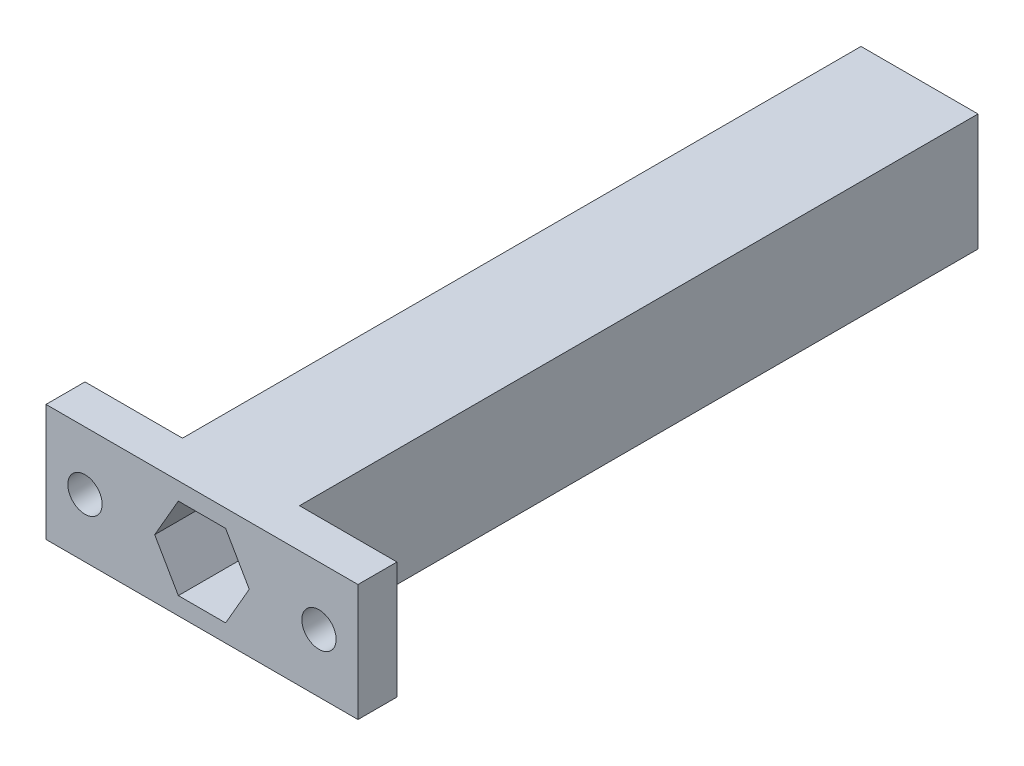
ISO-10303-21;
HEADER;
FILE_DESCRIPTION(('STEP AP214'),'2;1');
FILE_NAME('part.step','',(''),(''),'','','');
FILE_SCHEMA(('AUTOMOTIVE_DESIGN { 1 0 10303 214 1 1 1 1 }'));
ENDSEC;
DATA;
#1=APPLICATION_CONTEXT('core data for automotive mechanical design processes');
#2=APPLICATION_PROTOCOL_DEFINITION('international standard','automotive_design',2000,#1);
#3=PRODUCT_CONTEXT('',#1,'mechanical');
#4=PRODUCT('Part','Part','',(#3));
#5=PRODUCT_RELATED_PRODUCT_CATEGORY('part','',(#4));
#6=PRODUCT_DEFINITION_FORMATION('','',#4);
#7=PRODUCT_DEFINITION_CONTEXT('part definition',#1,'design');
#8=PRODUCT_DEFINITION('design','',#6,#7);
#9=PRODUCT_DEFINITION_SHAPE('','',#8);
#10=(LENGTH_UNIT() NAMED_UNIT(*) SI_UNIT(.MILLI.,.METRE.));
#11=(NAMED_UNIT(*) PLANE_ANGLE_UNIT() SI_UNIT($,.RADIAN.));
#12=(NAMED_UNIT(*) SI_UNIT($,.STERADIAN.) SOLID_ANGLE_UNIT());
#13=UNCERTAINTY_MEASURE_WITH_UNIT(LENGTH_MEASURE(1.E-05),#10,'distance_accuracy_value','');
#14=(GEOMETRIC_REPRESENTATION_CONTEXT(3) GLOBAL_UNCERTAINTY_ASSIGNED_CONTEXT((#13)) GLOBAL_UNIT_ASSIGNED_CONTEXT((#10,
#11,#12)) REPRESENTATION_CONTEXT('',''));
#15=CARTESIAN_POINT('',(0.,0.,0.));
#16=DIRECTION('',(0.,0.,1.));
#17=DIRECTION('',(1.,0.,0.));
#18=AXIS2_PLACEMENT_3D('',#15,#16,#17);
#19=CARTESIAN_POINT('',(43.4999999999998,25.9999999999997,92.));
#20=DIRECTION('',(0.,0.,-1.));
#21=DIRECTION('',(-1.,0.,0.));
#22=AXIS2_PLACEMENT_3D('',#19,#20,#21);
#23=CYLINDRICAL_SURFACE('',#22,3.2);
#24=CARTESIAN_POINT('',(43.4999999999998,25.9999999999997,0.));
#25=DIRECTION('',(0.,0.,1.));
#26=DIRECTION('',(1.,0.,0.));
#27=AXIS2_PLACEMENT_3D('',#24,#25,#26);
#28=CIRCLE('',#27,3.2);
#29=CARTESIAN_POINT('',(46.6999999999998,25.9999999999997,0.));
#30=VERTEX_POINT('',#29);
#31=EDGE_CURVE('E238',#30,#30,#28,.T.);
#32=ORIENTED_EDGE('',*,*,#31,.F.);
#33=EDGE_LOOP('',(#32));
#34=FACE_BOUND('',#33,.T.);
#35=CARTESIAN_POINT('',(43.4999999999998,25.9999999999997,17.));
#36=DIRECTION('',(0.,0.,1.));
#37=DIRECTION('',(1.,0.,0.));
#38=AXIS2_PLACEMENT_3D('',#35,#36,#37);
#39=CIRCLE('',#38,3.2);
#40=CARTESIAN_POINT('',(46.6999999999998,25.9999999999997,17.));
#41=VERTEX_POINT('',#40);
#42=EDGE_CURVE('E37',#41,#41,#39,.T.);
#43=ORIENTED_EDGE('',*,*,#42,.T.);
#44=EDGE_LOOP('',(#43));
#45=FACE_BOUND('',#44,.T.);
#46=ADVANCED_FACE('F33',(#34,#45),#23,.F.);
#47=CARTESIAN_POINT('',(35.9999999999998,33.4999999999997,92.));
#48=DIRECTION('',(1.,0.,0.));
#49=DIRECTION('',(0.,1.,0.));
#50=AXIS2_PLACEMENT_3D('',#47,#48,#49);
#51=PLANE('',#50);
#52=DIRECTION('',(0.,-1.,0.));
#53=VECTOR('',#52,1.);
#54=CARTESIAN_POINT('',(35.9999999999998,33.4999999999997,87.));
#55=LINE('',#54,#53);
#56=CARTESIAN_POINT('',(35.9999999999998,33.4999999999997,87.));
#57=VERTEX_POINT('',#56);
#58=CARTESIAN_POINT('',(35.9999999999998,18.4999999999997,87.));
#59=VERTEX_POINT('',#58);
#60=EDGE_CURVE('E236',#57,#59,#55,.T.);
#61=ORIENTED_EDGE('',*,*,#60,.F.);
#62=DIRECTION('',(0.,0.,-1.));
#63=VECTOR('',#62,1.);
#64=CARTESIAN_POINT('',(35.9999999999998,33.4999999999997,92.));
#65=LINE('',#64,#63);
#66=CARTESIAN_POINT('',(35.9999999999998,33.4999999999997,0.));
#67=VERTEX_POINT('',#66);
#68=EDGE_CURVE('E57',#57,#67,#65,.T.);
#69=ORIENTED_EDGE('',*,*,#68,.T.);
#70=DIRECTION('',(0.,-1.,0.));
#71=VECTOR('',#70,1.);
#72=CARTESIAN_POINT('',(35.9999999999998,33.4999999999997,0.));
#73=LINE('',#72,#71);
#74=CARTESIAN_POINT('',(35.9999999999998,18.4999999999997,0.));
#75=VERTEX_POINT('',#74);
#76=EDGE_CURVE('E241',#67,#75,#73,.T.);
#77=ORIENTED_EDGE('',*,*,#76,.T.);
#78=DIRECTION('',(0.,0.,-1.));
#79=VECTOR('',#78,1.);
#80=CARTESIAN_POINT('',(35.9999999999998,18.4999999999997,92.));
#81=LINE('',#80,#79);
#82=EDGE_CURVE('E11',#59,#75,#81,.T.);
#83=ORIENTED_EDGE('',*,*,#82,.F.);
#84=EDGE_LOOP('',(#61,#69,#77,#83));
#85=FACE_BOUND('',#84,.T.);
#86=ADVANCED_FACE('F35',(#85),#51,.F.);
#87=CARTESIAN_POINT('',(50.9999999999998,33.4999999999997,92.));
#88=DIRECTION('',(-1.,0.,0.));
#89=DIRECTION('',(0.,-1.,0.));
#90=AXIS2_PLACEMENT_3D('',#87,#88,#89);
#91=PLANE('',#90);
#92=DIRECTION('',(0.,1.,0.));
#93=VECTOR('',#92,1.);
#94=CARTESIAN_POINT('',(50.9999999999998,33.4999999999997,87.));
#95=LINE('',#94,#93);
#96=CARTESIAN_POINT('',(50.9999999999998,18.4999999999997,87.));
#97=VERTEX_POINT('',#96);
#98=CARTESIAN_POINT('',(50.9999999999998,33.4999999999997,87.));
#99=VERTEX_POINT('',#98);
#100=EDGE_CURVE('E226',#97,#99,#95,.T.);
#101=ORIENTED_EDGE('',*,*,#100,.F.);
#102=DIRECTION('',(0.,0.,-1.));
#103=VECTOR('',#102,1.);
#104=CARTESIAN_POINT('',(50.9999999999998,18.4999999999997,92.));
#105=LINE('',#104,#103);
#106=CARTESIAN_POINT('',(50.9999999999998,18.4999999999997,0.));
#107=VERTEX_POINT('',#106);
#108=EDGE_CURVE('E42',#97,#107,#105,.T.);
#109=ORIENTED_EDGE('',*,*,#108,.T.);
#110=DIRECTION('',(0.,1.,0.));
#111=VECTOR('',#110,1.);
#112=CARTESIAN_POINT('',(50.9999999999998,33.4999999999997,0.));
#113=LINE('',#112,#111);
#114=CARTESIAN_POINT('',(50.9999999999998,33.4999999999997,0.));
#115=VERTEX_POINT('',#114);
#116=EDGE_CURVE('E251',#107,#115,#113,.T.);
#117=ORIENTED_EDGE('',*,*,#116,.T.);
#118=DIRECTION('',(0.,0.,-1.));
#119=VECTOR('',#118,1.);
#120=CARTESIAN_POINT('',(50.9999999999998,33.4999999999997,92.));
#121=LINE('',#120,#119);
#122=EDGE_CURVE('E256',#99,#115,#121,.T.);
#123=ORIENTED_EDGE('',*,*,#122,.F.);
#124=EDGE_LOOP('',(#101,#109,#117,#123));
#125=FACE_BOUND('',#124,.T.);
#126=ADVANCED_FACE('F261',(#125),#91,.F.);
#127=CARTESIAN_POINT('',(0.,0.,92.));
#128=DIRECTION('',(0.,0.,-1.));
#129=DIRECTION('',(-1.,0.,0.));
#130=AXIS2_PLACEMENT_3D('',#127,#128,#129);
#131=PLANE('',#130);
#132=DIRECTION('',(1.,0.,0.));
#133=VECTOR('',#132,1.);
#134=CARTESIAN_POINT('',(40.4689110867545,20.75,92.));
#135=LINE('',#134,#133);
#136=CARTESIAN_POINT('',(40.4689110867545,20.75,92.));
#137=VERTEX_POINT('',#136);
#138=CARTESIAN_POINT('',(46.5310889132455,20.75,92.));
#139=VERTEX_POINT('',#138);
#140=EDGE_CURVE('E171',#137,#139,#135,.T.);
#141=ORIENTED_EDGE('',*,*,#140,.F.);
#142=DIRECTION('',(0.5,-0.866025403784439,0.));
#143=VECTOR('',#142,1.);
#144=CARTESIAN_POINT('',(37.4378221735089,26.,92.));
#145=LINE('',#144,#143);
#146=CARTESIAN_POINT('',(37.4378221735089,26.,92.));
#147=VERTEX_POINT('',#146);
#148=EDGE_CURVE('E49',#147,#137,#145,.T.);
#149=ORIENTED_EDGE('',*,*,#148,.F.);
#150=DIRECTION('',(-0.500000000000001,-0.866025403784438,0.));
#151=VECTOR('',#150,1.);
#152=CARTESIAN_POINT('',(40.4689110867545,31.25,92.));
#153=LINE('',#152,#151);
#154=CARTESIAN_POINT('',(40.4689110867545,31.25,92.));
#155=VERTEX_POINT('',#154);
#156=EDGE_CURVE('E157',#155,#147,#153,.T.);
#157=ORIENTED_EDGE('',*,*,#156,.F.);
#158=DIRECTION('',(-1.,0.,0.));
#159=VECTOR('',#158,1.);
#160=CARTESIAN_POINT('',(46.5310889132455,31.25,92.));
#161=LINE('',#160,#159);
#162=CARTESIAN_POINT('',(46.5310889132455,31.25,92.));
#163=VERTEX_POINT('',#162);
#164=EDGE_CURVE('E160',#163,#155,#161,.T.);
#165=ORIENTED_EDGE('',*,*,#164,.F.);
#166=DIRECTION('',(-0.499999999999999,0.866025403784439,0.));
#167=VECTOR('',#166,1.);
#168=CARTESIAN_POINT('',(49.5621778264911,26.,92.));
#169=LINE('',#168,#167);
#170=CARTESIAN_POINT('',(49.5621778264911,26.,92.));
#171=VERTEX_POINT('',#170);
#172=EDGE_CURVE('E176',#171,#163,#169,.T.);
#173=ORIENTED_EDGE('',*,*,#172,.F.);
#174=DIRECTION('',(0.5,0.866025403784439,0.));
#175=VECTOR('',#174,1.);
#176=CARTESIAN_POINT('',(46.5310889132455,20.75,92.));
#177=LINE('',#176,#175);
#178=EDGE_CURVE('E173',#139,#171,#177,.T.);
#179=ORIENTED_EDGE('',*,*,#178,.F.);
#180=EDGE_LOOP('',(#141,#149,#157,#165,#173,#179));
#181=FACE_BOUND('',#180,.T.);
#182=DIRECTION('',(-1.,0.,0.));
#183=VECTOR('',#182,1.);
#184=CARTESIAN_POINT('',(50.9999999999998,33.4999999999997,92.));
#185=LINE('',#184,#183);
#186=CARTESIAN_POINT('',(63.4999999999998,33.4999999999997,92.));
#187=VERTEX_POINT('',#186);
#188=CARTESIAN_POINT('',(23.4999999999998,33.4999999999997,92.));
#189=VERTEX_POINT('',#188);
#190=EDGE_CURVE('E244',#187,#189,#185,.T.);
#191=ORIENTED_EDGE('',*,*,#190,.T.);
#192=DIRECTION('',(0.,-1.,0.));
#193=VECTOR('',#192,1.);
#194=CARTESIAN_POINT('',(23.4999999999998,33.4999999999997,92.));
#195=LINE('',#194,#193);
#196=CARTESIAN_POINT('',(23.4999999999998,18.4999999999997,92.));
#197=VERTEX_POINT('',#196);
#198=EDGE_CURVE('E207',#189,#197,#195,.T.);
#199=ORIENTED_EDGE('',*,*,#198,.T.);
#200=DIRECTION('',(1.,0.,0.));
#201=VECTOR('',#200,1.);
#202=CARTESIAN_POINT('',(50.9999999999998,18.4999999999997,92.));
#203=LINE('',#202,#201);
#204=CARTESIAN_POINT('',(63.4999999999998,18.4999999999997,92.));
#205=VERTEX_POINT('',#204);
#206=EDGE_CURVE('E242',#197,#205,#203,.T.);
#207=ORIENTED_EDGE('',*,*,#206,.T.);
#208=DIRECTION('',(0.,1.,0.));
#209=VECTOR('',#208,1.);
#210=CARTESIAN_POINT('',(63.4999999999998,33.4999999999997,92.));
#211=LINE('',#210,#209);
#212=EDGE_CURVE('E200',#205,#187,#211,.T.);
#213=ORIENTED_EDGE('',*,*,#212,.T.);
#214=EDGE_LOOP('',(#191,#199,#207,#213));
#215=FACE_BOUND('',#214,.T.);
#216=CARTESIAN_POINT('',(58.4999999999998,25.9999999999997,92.));
#217=DIRECTION('',(0.,0.,1.));
#218=DIRECTION('',(1.,0.,0.));
#219=AXIS2_PLACEMENT_3D('',#216,#217,#218);
#220=CIRCLE('',#219,2.2);
#221=CARTESIAN_POINT('',(60.6999999999998,25.9999999999997,92.));
#222=VERTEX_POINT('',#221);
#223=EDGE_CURVE('E193',#222,#222,#220,.T.);
#224=ORIENTED_EDGE('',*,*,#223,.F.);
#225=EDGE_LOOP('',(#224));
#226=FACE_BOUND('',#225,.T.);
#227=CARTESIAN_POINT('',(28.4999999999998,25.9999999999997,92.));
#228=DIRECTION('',(0.,0.,1.));
#229=DIRECTION('',(1.,0.,0.));
#230=AXIS2_PLACEMENT_3D('',#227,#228,#229);
#231=CIRCLE('',#230,2.2);
#232=CARTESIAN_POINT('',(30.6999999999998,25.9999999999997,92.));
#233=VERTEX_POINT('',#232);
#234=EDGE_CURVE('E194',#233,#233,#231,.T.);
#235=ORIENTED_EDGE('',*,*,#234,.F.);
#236=EDGE_LOOP('',(#235));
#237=FACE_BOUND('',#236,.T.);
#238=ADVANCED_FACE('F290',(#181,#215,#226,#237),#131,.F.);
#239=CARTESIAN_POINT('',(0.,0.,0.));
#240=DIRECTION('',(0.,0.,-1.));
#241=DIRECTION('',(-1.,0.,0.));
#242=AXIS2_PLACEMENT_3D('',#239,#240,#241);
#243=PLANE('',#242);
#244=ORIENTED_EDGE('',*,*,#76,.F.);
#245=DIRECTION('',(-1.,0.,0.));
#246=VECTOR('',#245,1.);
#247=CARTESIAN_POINT('',(50.9999999999998,33.4999999999997,0.));
#248=LINE('',#247,#246);
#249=EDGE_CURVE('E245',#115,#67,#248,.T.);
#250=ORIENTED_EDGE('',*,*,#249,.F.);
#251=ORIENTED_EDGE('',*,*,#116,.F.);
#252=DIRECTION('',(1.,0.,0.));
#253=VECTOR('',#252,1.);
#254=CARTESIAN_POINT('',(50.9999999999998,18.4999999999997,0.));
#255=LINE('',#254,#253);
#256=EDGE_CURVE('E248',#75,#107,#255,.T.);
#257=ORIENTED_EDGE('',*,*,#256,.F.);
#258=EDGE_LOOP('',(#244,#250,#251,#257));
#259=FACE_BOUND('',#258,.T.);
#260=ORIENTED_EDGE('',*,*,#31,.T.);
#261=EDGE_LOOP('',(#260));
#262=FACE_BOUND('',#261,.T.);
#263=ADVANCED_FACE('F271',(#259,#262),#243,.T.);
#264=CARTESIAN_POINT('',(50.9999999999998,18.4999999999997,92.));
#265=DIRECTION('',(0.,1.,0.));
#266=DIRECTION('',(0.,0.,1.));
#267=AXIS2_PLACEMENT_3D('',#264,#265,#266);
#268=PLANE('',#267);
#269=ORIENTED_EDGE('',*,*,#206,.F.);
#270=DIRECTION('',(0.,0.,1.));
#271=VECTOR('',#270,1.);
#272=CARTESIAN_POINT('',(23.4999999999998,18.4999999999997,87.));
#273=LINE('',#272,#271);
#274=CARTESIAN_POINT('',(23.4999999999998,18.4999999999997,87.));
#275=VERTEX_POINT('',#274);
#276=EDGE_CURVE('E227',#275,#197,#273,.T.);
#277=ORIENTED_EDGE('',*,*,#276,.F.);
#278=DIRECTION('',(1.,0.,0.));
#279=VECTOR('',#278,1.);
#280=CARTESIAN_POINT('',(23.4999999999998,18.4999999999997,87.));
#281=LINE('',#280,#279);
#282=EDGE_CURVE('E215',#275,#59,#281,.T.);
#283=ORIENTED_EDGE('',*,*,#282,.T.);
#284=ORIENTED_EDGE('',*,*,#82,.T.);
#285=ORIENTED_EDGE('',*,*,#256,.T.);
#286=ORIENTED_EDGE('',*,*,#108,.F.);
#287=CARTESIAN_POINT('',(63.4999999999998,18.4999999999997,87.));
#288=VERTEX_POINT('',#287);
#289=EDGE_CURVE('E214',#97,#288,#281,.T.);
#290=ORIENTED_EDGE('',*,*,#289,.T.);
#291=DIRECTION('',(0.,0.,1.));
#292=VECTOR('',#291,1.);
#293=CARTESIAN_POINT('',(63.4999999999998,18.4999999999997,87.));
#294=LINE('',#293,#292);
#295=EDGE_CURVE('E223',#288,#205,#294,.T.);
#296=ORIENTED_EDGE('',*,*,#295,.T.);
#297=EDGE_LOOP('',(#269,#277,#283,#284,#285,#286,#290,#296));
#298=FACE_BOUND('',#297,.T.);
#299=ADVANCED_FACE('F267',(#298),#268,.F.);
#300=CARTESIAN_POINT('',(50.9999999999998,33.4999999999997,92.));
#301=DIRECTION('',(0.,-1.,0.));
#302=DIRECTION('',(1.,0.,0.));
#303=AXIS2_PLACEMENT_3D('',#300,#301,#302);
#304=PLANE('',#303);
#305=ORIENTED_EDGE('',*,*,#190,.F.);
#306=DIRECTION('',(0.,0.,1.));
#307=VECTOR('',#306,1.);
#308=CARTESIAN_POINT('',(63.4999999999998,33.4999999999997,87.));
#309=LINE('',#308,#307);
#310=CARTESIAN_POINT('',(63.4999999999998,33.4999999999997,87.));
#311=VERTEX_POINT('',#310);
#312=EDGE_CURVE('E218',#311,#187,#309,.T.);
#313=ORIENTED_EDGE('',*,*,#312,.F.);
#314=DIRECTION('',(-1.,0.,0.));
#315=VECTOR('',#314,1.);
#316=CARTESIAN_POINT('',(23.4999999999998,33.4999999999997,87.));
#317=LINE('',#316,#315);
#318=EDGE_CURVE('E208',#311,#99,#317,.T.);
#319=ORIENTED_EDGE('',*,*,#318,.T.);
#320=ORIENTED_EDGE('',*,*,#122,.T.);
#321=ORIENTED_EDGE('',*,*,#249,.T.);
#322=ORIENTED_EDGE('',*,*,#68,.F.);
#323=CARTESIAN_POINT('',(23.4999999999998,33.4999999999997,87.));
#324=VERTEX_POINT('',#323);
#325=EDGE_CURVE('E206',#57,#324,#317,.T.);
#326=ORIENTED_EDGE('',*,*,#325,.T.);
#327=DIRECTION('',(0.,0.,1.));
#328=VECTOR('',#327,1.);
#329=CARTESIAN_POINT('',(23.4999999999998,33.4999999999997,87.));
#330=LINE('',#329,#328);
#331=EDGE_CURVE('E230',#324,#189,#330,.T.);
#332=ORIENTED_EDGE('',*,*,#331,.T.);
#333=EDGE_LOOP('',(#305,#313,#319,#320,#321,#322,#326,#332));
#334=FACE_BOUND('',#333,.T.);
#335=ADVANCED_FACE('F274',(#334),#304,.F.);
#336=CARTESIAN_POINT('',(58.4999999999998,25.9999999999997,87.));
#337=DIRECTION('',(0.,0.,1.));
#338=DIRECTION('',(1.,0.,0.));
#339=AXIS2_PLACEMENT_3D('',#336,#337,#338);
#340=CYLINDRICAL_SURFACE('',#339,2.2);
#341=CARTESIAN_POINT('',(58.4999999999998,25.9999999999997,87.));
#342=DIRECTION('',(0.,0.,1.));
#343=DIRECTION('',(1.,0.,0.));
#344=AXIS2_PLACEMENT_3D('',#341,#342,#343);
#345=CIRCLE('',#344,2.2);
#346=CARTESIAN_POINT('',(60.6999999999998,25.9999999999997,87.));
#347=VERTEX_POINT('',#346);
#348=EDGE_CURVE('E197',#347,#347,#345,.T.);
#349=ORIENTED_EDGE('',*,*,#348,.F.);
#350=EDGE_LOOP('',(#349));
#351=FACE_BOUND('',#350,.T.);
#352=ORIENTED_EDGE('',*,*,#223,.T.);
#353=EDGE_LOOP('',(#352));
#354=FACE_BOUND('',#353,.T.);
#355=ADVANCED_FACE('F315',(#351,#354),#340,.F.);
#356=CARTESIAN_POINT('',(63.4999999999998,33.4999999999997,87.));
#357=DIRECTION('',(1.,0.,0.));
#358=DIRECTION('',(0.,0.,-1.));
#359=AXIS2_PLACEMENT_3D('',#356,#357,#358);
#360=PLANE('',#359);
#361=ORIENTED_EDGE('',*,*,#212,.F.);
#362=ORIENTED_EDGE('',*,*,#295,.F.);
#363=DIRECTION('',(0.,1.,0.));
#364=VECTOR('',#363,1.);
#365=CARTESIAN_POINT('',(63.4999999999998,33.4999999999997,87.));
#366=LINE('',#365,#364);
#367=EDGE_CURVE('E203',#288,#311,#366,.T.);
#368=ORIENTED_EDGE('',*,*,#367,.T.);
#369=ORIENTED_EDGE('',*,*,#312,.T.);
#370=EDGE_LOOP('',(#361,#362,#368,#369));
#371=FACE_BOUND('',#370,.T.);
#372=ADVANCED_FACE('F282',(#371),#360,.T.);
#373=CARTESIAN_POINT('',(0.,0.,87.));
#374=DIRECTION('',(0.,0.,1.));
#375=DIRECTION('',(1.,0.,0.));
#376=AXIS2_PLACEMENT_3D('',#373,#374,#375);
#377=PLANE('',#376);
#378=ORIENTED_EDGE('',*,*,#348,.T.);
#379=EDGE_LOOP('',(#378));
#380=FACE_BOUND('',#379,.T.);
#381=ORIENTED_EDGE('',*,*,#289,.F.);
#382=ORIENTED_EDGE('',*,*,#100,.T.);
#383=ORIENTED_EDGE('',*,*,#318,.F.);
#384=ORIENTED_EDGE('',*,*,#367,.F.);
#385=EDGE_LOOP('',(#381,#382,#383,#384));
#386=FACE_BOUND('',#385,.T.);
#387=ADVANCED_FACE('F278',(#380,#386),#377,.F.);
#388=CARTESIAN_POINT('',(28.4999999999998,25.9999999999997,87.));
#389=DIRECTION('',(0.,0.,1.));
#390=DIRECTION('',(1.,0.,0.));
#391=AXIS2_PLACEMENT_3D('',#388,#389,#390);
#392=CIRCLE('',#391,2.2);
#393=CARTESIAN_POINT('',(30.6999999999998,25.9999999999997,87.));
#394=VERTEX_POINT('',#393);
#395=EDGE_CURVE('E190',#394,#394,#392,.T.);
#396=ORIENTED_EDGE('',*,*,#395,.T.);
#397=EDGE_LOOP('',(#396));
#398=FACE_BOUND('',#397,.T.);
#399=ORIENTED_EDGE('',*,*,#325,.F.);
#400=ORIENTED_EDGE('',*,*,#60,.T.);
#401=ORIENTED_EDGE('',*,*,#282,.F.);
#402=DIRECTION('',(0.,-1.,0.));
#403=VECTOR('',#402,1.);
#404=CARTESIAN_POINT('',(23.4999999999998,33.4999999999997,87.));
#405=LINE('',#404,#403);
#406=EDGE_CURVE('E211',#324,#275,#405,.T.);
#407=ORIENTED_EDGE('',*,*,#406,.F.);
#408=EDGE_LOOP('',(#399,#400,#401,#407));
#409=FACE_BOUND('',#408,.T.);
#410=ADVANCED_FACE('F293',(#398,#409),#377,.F.);
#411=CARTESIAN_POINT('',(23.4999999999998,33.4999999999997,87.));
#412=DIRECTION('',(-1.,0.,0.));
#413=DIRECTION('',(0.,0.,1.));
#414=AXIS2_PLACEMENT_3D('',#411,#412,#413);
#415=PLANE('',#414);
#416=ORIENTED_EDGE('',*,*,#198,.F.);
#417=ORIENTED_EDGE('',*,*,#331,.F.);
#418=ORIENTED_EDGE('',*,*,#406,.T.);
#419=ORIENTED_EDGE('',*,*,#276,.T.);
#420=EDGE_LOOP('',(#416,#417,#418,#419));
#421=FACE_BOUND('',#420,.T.);
#422=ADVANCED_FACE('F286',(#421),#415,.T.);
#423=CARTESIAN_POINT('',(28.4999999999998,25.9999999999997,87.));
#424=DIRECTION('',(0.,0.,1.));
#425=DIRECTION('',(1.,0.,0.));
#426=AXIS2_PLACEMENT_3D('',#423,#424,#425);
#427=CYLINDRICAL_SURFACE('',#426,2.2);
#428=ORIENTED_EDGE('',*,*,#395,.F.);
#429=EDGE_LOOP('',(#428));
#430=FACE_BOUND('',#429,.T.);
#431=ORIENTED_EDGE('',*,*,#234,.T.);
#432=EDGE_LOOP('',(#431));
#433=FACE_BOUND('',#432,.T.);
#434=ADVANCED_FACE('F357',(#430,#433),#427,.F.);
#435=CARTESIAN_POINT('',(37.4378221735089,26.,17.));
#436=DIRECTION('',(-0.866025403784439,-0.5,0.));
#437=DIRECTION('',(0.5,-0.866025403784439,0.));
#438=AXIS2_PLACEMENT_3D('',#435,#436,#437);
#439=PLANE('',#438);
#440=ORIENTED_EDGE('',*,*,#148,.T.);
#441=DIRECTION('',(0.,0.,1.));
#442=VECTOR('',#441,1.);
#443=CARTESIAN_POINT('',(40.4689110867545,20.75,17.));
#444=LINE('',#443,#442);
#445=CARTESIAN_POINT('',(40.4689110867545,20.75,17.));
#446=VERTEX_POINT('',#445);
#447=EDGE_CURVE('E134',#446,#137,#444,.T.);
#448=ORIENTED_EDGE('',*,*,#447,.F.);
#449=DIRECTION('',(0.5,-0.866025403784439,0.));
#450=VECTOR('',#449,1.);
#451=CARTESIAN_POINT('',(37.4378221735089,26.,17.));
#452=LINE('',#451,#450);
#453=CARTESIAN_POINT('',(37.4378221735089,26.,17.));
#454=VERTEX_POINT('',#453);
#455=EDGE_CURVE('E138',#454,#446,#452,.T.);
#456=ORIENTED_EDGE('',*,*,#455,.F.);
#457=DIRECTION('',(0.,0.,1.));
#458=VECTOR('',#457,1.);
#459=CARTESIAN_POINT('',(37.4378221735089,26.,17.));
#460=LINE('',#459,#458);
#461=EDGE_CURVE('E181',#454,#147,#460,.T.);
#462=ORIENTED_EDGE('',*,*,#461,.T.);
#463=EDGE_LOOP('',(#440,#448,#456,#462));
#464=FACE_BOUND('',#463,.T.);
#465=ADVANCED_FACE('F136',(#464),#439,.F.);
#466=CARTESIAN_POINT('',(40.4689110867545,31.25,17.));
#467=DIRECTION('',(-0.866025403784438,0.500000000000001,0.));
#468=DIRECTION('',(-0.500000000000001,-0.866025403784438,0.));
#469=AXIS2_PLACEMENT_3D('',#466,#467,#468);
#470=PLANE('',#469);
#471=ORIENTED_EDGE('',*,*,#156,.T.);
#472=ORIENTED_EDGE('',*,*,#461,.F.);
#473=DIRECTION('',(-0.500000000000001,-0.866025403784438,0.));
#474=VECTOR('',#473,1.);
#475=CARTESIAN_POINT('',(40.4689110867545,31.25,17.));
#476=LINE('',#475,#474);
#477=CARTESIAN_POINT('',(40.4689110867545,31.25,17.));
#478=VERTEX_POINT('',#477);
#479=EDGE_CURVE('E144',#478,#454,#476,.T.);
#480=ORIENTED_EDGE('',*,*,#479,.F.);
#481=DIRECTION('',(0.,0.,1.));
#482=VECTOR('',#481,1.);
#483=CARTESIAN_POINT('',(40.4689110867545,31.25,17.));
#484=LINE('',#483,#482);
#485=EDGE_CURVE('E183',#478,#155,#484,.T.);
#486=ORIENTED_EDGE('',*,*,#485,.T.);
#487=EDGE_LOOP('',(#471,#472,#480,#486));
#488=FACE_BOUND('',#487,.T.);
#489=ADVANCED_FACE('F370',(#488),#470,.F.);
#490=CARTESIAN_POINT('',(46.5310889132455,31.25,17.));
#491=DIRECTION('',(0.,1.,0.));
#492=DIRECTION('',(-1.,0.,0.));
#493=AXIS2_PLACEMENT_3D('',#490,#491,#492);
#494=PLANE('',#493);
#495=ORIENTED_EDGE('',*,*,#164,.T.);
#496=ORIENTED_EDGE('',*,*,#485,.F.);
#497=DIRECTION('',(-1.,0.,0.));
#498=VECTOR('',#497,1.);
#499=CARTESIAN_POINT('',(46.5310889132455,31.25,17.));
#500=LINE('',#499,#498);
#501=CARTESIAN_POINT('',(46.5310889132455,31.25,17.));
#502=VERTEX_POINT('',#501);
#503=EDGE_CURVE('E167',#502,#478,#500,.T.);
#504=ORIENTED_EDGE('',*,*,#503,.F.);
#505=DIRECTION('',(0.,0.,1.));
#506=VECTOR('',#505,1.);
#507=CARTESIAN_POINT('',(46.5310889132455,31.25,17.));
#508=LINE('',#507,#506);
#509=EDGE_CURVE('E185',#502,#163,#508,.T.);
#510=ORIENTED_EDGE('',*,*,#509,.T.);
#511=EDGE_LOOP('',(#495,#496,#504,#510));
#512=FACE_BOUND('',#511,.T.);
#513=ADVANCED_FACE('F378',(#512),#494,.F.);
#514=CARTESIAN_POINT('',(49.5621778264911,26.,17.));
#515=DIRECTION('',(0.866025403784439,0.499999999999999,0.));
#516=DIRECTION('',(-0.5,0.866025403784439,0.));
#517=AXIS2_PLACEMENT_3D('',#514,#515,#516);
#518=PLANE('',#517);
#519=ORIENTED_EDGE('',*,*,#172,.T.);
#520=ORIENTED_EDGE('',*,*,#509,.F.);
#521=DIRECTION('',(-0.499999999999999,0.866025403784439,0.));
#522=VECTOR('',#521,1.);
#523=CARTESIAN_POINT('',(49.5621778264911,26.,17.));
#524=LINE('',#523,#522);
#525=CARTESIAN_POINT('',(49.5621778264911,26.,17.));
#526=VERTEX_POINT('',#525);
#527=EDGE_CURVE('E164',#526,#502,#524,.T.);
#528=ORIENTED_EDGE('',*,*,#527,.F.);
#529=DIRECTION('',(0.,0.,1.));
#530=VECTOR('',#529,1.);
#531=CARTESIAN_POINT('',(49.5621778264911,26.,17.));
#532=LINE('',#531,#530);
#533=EDGE_CURVE('E187',#526,#171,#532,.T.);
#534=ORIENTED_EDGE('',*,*,#533,.T.);
#535=EDGE_LOOP('',(#519,#520,#528,#534));
#536=FACE_BOUND('',#535,.T.);
#537=ADVANCED_FACE('F386',(#536),#518,.F.);
#538=CARTESIAN_POINT('',(46.5310889132455,20.75,17.));
#539=DIRECTION('',(0.866025403784439,-0.5,0.));
#540=DIRECTION('',(0.5,0.866025403784439,0.));
#541=AXIS2_PLACEMENT_3D('',#538,#539,#540);
#542=PLANE('',#541);
#543=ORIENTED_EDGE('',*,*,#178,.T.);
#544=ORIENTED_EDGE('',*,*,#533,.F.);
#545=DIRECTION('',(0.5,0.866025403784439,0.));
#546=VECTOR('',#545,1.);
#547=CARTESIAN_POINT('',(46.5310889132455,20.75,17.));
#548=LINE('',#547,#546);
#549=CARTESIAN_POINT('',(46.5310889132455,20.75,17.));
#550=VERTEX_POINT('',#549);
#551=EDGE_CURVE('E152',#550,#526,#548,.T.);
#552=ORIENTED_EDGE('',*,*,#551,.F.);
#553=DIRECTION('',(0.,0.,1.));
#554=VECTOR('',#553,1.);
#555=CARTESIAN_POINT('',(46.5310889132455,20.75,17.));
#556=LINE('',#555,#554);
#557=EDGE_CURVE('E143',#550,#139,#556,.T.);
#558=ORIENTED_EDGE('',*,*,#557,.T.);
#559=EDGE_LOOP('',(#543,#544,#552,#558));
#560=FACE_BOUND('',#559,.T.);
#561=ADVANCED_FACE('F394',(#560),#542,.F.);
#562=CARTESIAN_POINT('',(40.4689110867545,20.75,17.));
#563=DIRECTION('',(0.,-1.,0.));
#564=DIRECTION('',(1.,0.,0.));
#565=AXIS2_PLACEMENT_3D('',#562,#563,#564);
#566=PLANE('',#565);
#567=ORIENTED_EDGE('',*,*,#140,.T.);
#568=ORIENTED_EDGE('',*,*,#557,.F.);
#569=DIRECTION('',(1.,0.,0.));
#570=VECTOR('',#569,1.);
#571=CARTESIAN_POINT('',(40.4689110867545,20.75,17.));
#572=LINE('',#571,#570);
#573=EDGE_CURVE('E147',#446,#550,#572,.T.);
#574=ORIENTED_EDGE('',*,*,#573,.F.);
#575=ORIENTED_EDGE('',*,*,#447,.T.);
#576=EDGE_LOOP('',(#567,#568,#574,#575));
#577=FACE_BOUND('',#576,.T.);
#578=ADVANCED_FACE('F148',(#577),#566,.F.);
#579=CARTESIAN_POINT('',(0.,0.,17.));
#580=DIRECTION('',(0.,0.,1.));
#581=DIRECTION('',(1.,0.,0.));
#582=AXIS2_PLACEMENT_3D('',#579,#580,#581);
#583=PLANE('',#582);
#584=ORIENTED_EDGE('',*,*,#42,.F.);
#585=EDGE_LOOP('',(#584));
#586=FACE_BOUND('',#585,.T.);
#587=ORIENTED_EDGE('',*,*,#455,.T.);
#588=ORIENTED_EDGE('',*,*,#573,.T.);
#589=ORIENTED_EDGE('',*,*,#551,.T.);
#590=ORIENTED_EDGE('',*,*,#527,.T.);
#591=ORIENTED_EDGE('',*,*,#503,.T.);
#592=ORIENTED_EDGE('',*,*,#479,.T.);
#593=EDGE_LOOP('',(#587,#588,#589,#590,#591,#592));
#594=FACE_BOUND('',#593,.T.);
#595=ADVANCED_FACE('F154',(#586,#594),#583,.T.);
#596=CLOSED_SHELL('',(#46,#86,#126,#238,#263,#299,#335,#355,#372,#387,#410,#422,#434,#465,#489,
#513,#537,#561,#578,#595));
#597=MANIFOLD_SOLID_BREP('B2',#596);
#598=ADVANCED_BREP_SHAPE_REPRESENTATION('',(#18,#597),#14);
#599=SHAPE_DEFINITION_REPRESENTATION(#9,#598);
ENDSEC;
END-ISO-10303-21;
